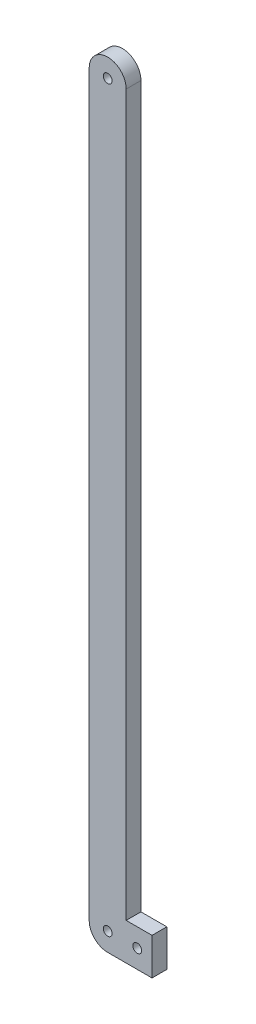
ISO-10303-21;
HEADER;
FILE_DESCRIPTION(('STEP AP214'),'2;1');
FILE_NAME('part.step','',(''),(''),'','','');
FILE_SCHEMA(('AUTOMOTIVE_DESIGN { 1 0 10303 214 1 1 1 1 }'));
ENDSEC;
DATA;
#1=APPLICATION_CONTEXT('core data for automotive mechanical design processes');
#2=APPLICATION_PROTOCOL_DEFINITION('international standard','automotive_design',2000,#1);
#3=PRODUCT_CONTEXT('',#1,'mechanical');
#4=PRODUCT('Part','Part','',(#3));
#5=PRODUCT_RELATED_PRODUCT_CATEGORY('part','',(#4));
#6=PRODUCT_DEFINITION_FORMATION('','',#4);
#7=PRODUCT_DEFINITION_CONTEXT('part definition',#1,'design');
#8=PRODUCT_DEFINITION('design','',#6,#7);
#9=PRODUCT_DEFINITION_SHAPE('','',#8);
#10=(LENGTH_UNIT() NAMED_UNIT(*) SI_UNIT(.MILLI.,.METRE.));
#11=(NAMED_UNIT(*) PLANE_ANGLE_UNIT() SI_UNIT($,.RADIAN.));
#12=(NAMED_UNIT(*) SI_UNIT($,.STERADIAN.) SOLID_ANGLE_UNIT());
#13=UNCERTAINTY_MEASURE_WITH_UNIT(LENGTH_MEASURE(1.E-05),#10,'distance_accuracy_value','');
#14=(GEOMETRIC_REPRESENTATION_CONTEXT(3) GLOBAL_UNCERTAINTY_ASSIGNED_CONTEXT((#13)) GLOBAL_UNIT_ASSIGNED_CONTEXT((#10,
#11,#12)) REPRESENTATION_CONTEXT('',''));
#15=CARTESIAN_POINT('',(0.,0.,0.));
#16=DIRECTION('',(0.,0.,1.));
#17=DIRECTION('',(1.,0.,0.));
#18=AXIS2_PLACEMENT_3D('',#15,#16,#17);
#19=CARTESIAN_POINT('',(0.,0.,10.));
#20=DIRECTION('',(0.,0.,1.));
#21=DIRECTION('',(1.,0.,0.));
#22=AXIS2_PLACEMENT_3D('',#19,#20,#21);
#23=PLANE('',#22);
#24=CARTESIAN_POINT('',(0.,-499.599839871872,10.));
#25=DIRECTION('',(0.,0.,1.));
#26=DIRECTION('',(-1.,0.,0.));
#27=AXIS2_PLACEMENT_3D('',#24,#25,#26);
#28=CIRCLE('',#27,3.);
#29=CARTESIAN_POINT('',(-3.,-499.599839871872,10.));
#30=VERTEX_POINT('',#29);
#31=EDGE_CURVE('E164',#30,#30,#28,.T.);
#32=ORIENTED_EDGE('',*,*,#31,.F.);
#33=EDGE_LOOP('',(#32));
#34=FACE_BOUND('',#33,.T.);
#35=CARTESIAN_POINT('',(0.,0.,10.));
#36=DIRECTION('',(0.,0.,1.));
#37=DIRECTION('',(1.,0.,0.));
#38=AXIS2_PLACEMENT_3D('',#35,#36,#37);
#39=CIRCLE('',#38,12.5);
#40=CARTESIAN_POINT('',(12.5,0.,10.));
#41=VERTEX_POINT('',#40);
#42=CARTESIAN_POINT('',(-12.5,0.,10.));
#43=VERTEX_POINT('',#42);
#44=EDGE_CURVE('E137',#41,#43,#39,.T.);
#45=ORIENTED_EDGE('',*,*,#44,.T.);
#46=DIRECTION('',(0.,-1.,0.));
#47=VECTOR('',#46,1.);
#48=CARTESIAN_POINT('',(-12.5,0.,10.));
#49=LINE('',#48,#47);
#50=CARTESIAN_POINT('',(-12.4999999999999,-499.599839871872,10.));
#51=VERTEX_POINT('',#50);
#52=EDGE_CURVE('E90',#43,#51,#49,.T.);
#53=ORIENTED_EDGE('',*,*,#52,.T.);
#54=CARTESIAN_POINT('',(0.,-499.599839871872,10.));
#55=DIRECTION('',(0.,0.,1.));
#56=DIRECTION('',(-1.,0.,0.));
#57=AXIS2_PLACEMENT_3D('',#54,#55,#56);
#58=CIRCLE('',#57,12.4999999999999);
#59=CARTESIAN_POINT('',(0.,-512.099839871872,10.));
#60=VERTEX_POINT('',#59);
#61=EDGE_CURVE('E149',#51,#60,#58,.T.);
#62=ORIENTED_EDGE('',*,*,#61,.T.);
#63=DIRECTION('',(1.,0.,0.));
#64=VECTOR('',#63,1.);
#65=CARTESIAN_POINT('',(0.,-512.099839871872,10.));
#66=LINE('',#65,#64);
#67=CARTESIAN_POINT('',(30.,-512.099839871872,10.));
#68=VERTEX_POINT('',#67);
#69=EDGE_CURVE('E106',#60,#68,#66,.T.);
#70=ORIENTED_EDGE('',*,*,#69,.T.);
#71=DIRECTION('',(0.,1.,0.));
#72=VECTOR('',#71,1.);
#73=CARTESIAN_POINT('',(30.,-512.099839871872,10.));
#74=LINE('',#73,#72);
#75=CARTESIAN_POINT('',(30.,-487.099839871872,10.));
#76=VERTEX_POINT('',#75);
#77=EDGE_CURVE('E100',#68,#76,#74,.T.);
#78=ORIENTED_EDGE('',*,*,#77,.T.);
#79=DIRECTION('',(-1.,0.,0.));
#80=VECTOR('',#79,1.);
#81=CARTESIAN_POINT('',(30.,-487.099839871872,10.));
#82=LINE('',#81,#80);
#83=CARTESIAN_POINT('',(12.5000000000001,-487.099839871872,10.));
#84=VERTEX_POINT('',#83);
#85=EDGE_CURVE('E104',#76,#84,#82,.T.);
#86=ORIENTED_EDGE('',*,*,#85,.T.);
#87=DIRECTION('',(0.,1.,0.));
#88=VECTOR('',#87,1.);
#89=CARTESIAN_POINT('',(12.5,0.,10.));
#90=LINE('',#89,#88);
#91=EDGE_CURVE('E50',#84,#41,#90,.T.);
#92=ORIENTED_EDGE('',*,*,#91,.T.);
#93=EDGE_LOOP('',(#45,#53,#62,#70,#78,#86,#92));
#94=FACE_BOUND('',#93,.T.);
#95=CARTESIAN_POINT('',(0.,0.,10.));
#96=DIRECTION('',(0.,0.,1.));
#97=DIRECTION('',(1.,0.,0.));
#98=AXIS2_PLACEMENT_3D('',#95,#96,#97);
#99=CIRCLE('',#98,3.);
#100=CARTESIAN_POINT('',(3.,0.,10.));
#101=VERTEX_POINT('',#100);
#102=EDGE_CURVE('E128',#101,#101,#99,.T.);
#103=ORIENTED_EDGE('',*,*,#102,.F.);
#104=EDGE_LOOP('',(#103));
#105=FACE_BOUND('',#104,.T.);
#106=CARTESIAN_POINT('',(20.,-499.599839871872,10.));
#107=DIRECTION('',(0.,0.,1.));
#108=DIRECTION('',(1.,0.,0.));
#109=AXIS2_PLACEMENT_3D('',#106,#107,#108);
#110=CIRCLE('',#109,3.);
#111=CARTESIAN_POINT('',(23.,-499.599839871872,10.));
#112=VERTEX_POINT('',#111);
#113=EDGE_CURVE('E170',#112,#112,#110,.T.);
#114=ORIENTED_EDGE('',*,*,#113,.F.);
#115=EDGE_LOOP('',(#114));
#116=FACE_BOUND('',#115,.T.);
#117=ADVANCED_FACE('F33',(#34,#94,#105,#116),#23,.T.);
#118=CARTESIAN_POINT('',(0.,0.,0.));
#119=DIRECTION('',(0.,0.,1.));
#120=DIRECTION('',(1.,0.,0.));
#121=AXIS2_PLACEMENT_3D('',#118,#119,#120);
#122=PLANE('',#121);
#123=CARTESIAN_POINT('',(0.,0.,0.));
#124=DIRECTION('',(0.,0.,1.));
#125=DIRECTION('',(1.,0.,0.));
#126=AXIS2_PLACEMENT_3D('',#123,#124,#125);
#127=CIRCLE('',#126,12.5);
#128=CARTESIAN_POINT('',(12.5,0.,0.));
#129=VERTEX_POINT('',#128);
#130=CARTESIAN_POINT('',(-12.5,0.,0.));
#131=VERTEX_POINT('',#130);
#132=EDGE_CURVE('E124',#129,#131,#127,.T.);
#133=ORIENTED_EDGE('',*,*,#132,.F.);
#134=DIRECTION('',(0.,1.,0.));
#135=VECTOR('',#134,1.);
#136=CARTESIAN_POINT('',(12.5,0.,0.));
#137=LINE('',#136,#135);
#138=CARTESIAN_POINT('',(12.5000000000001,-487.099839871872,0.));
#139=VERTEX_POINT('',#138);
#140=EDGE_CURVE('E82',#139,#129,#137,.T.);
#141=ORIENTED_EDGE('',*,*,#140,.F.);
#142=DIRECTION('',(-1.,0.,0.));
#143=VECTOR('',#142,1.);
#144=CARTESIAN_POINT('',(30.,-487.099839871872,0.));
#145=LINE('',#144,#143);
#146=CARTESIAN_POINT('',(30.,-487.099839871872,0.));
#147=VERTEX_POINT('',#146);
#148=EDGE_CURVE('E76',#147,#139,#145,.T.);
#149=ORIENTED_EDGE('',*,*,#148,.F.);
#150=DIRECTION('',(0.,1.,0.));
#151=VECTOR('',#150,1.);
#152=CARTESIAN_POINT('',(30.,-512.099839871872,0.));
#153=LINE('',#152,#151);
#154=CARTESIAN_POINT('',(30.,-512.099839871872,0.));
#155=VERTEX_POINT('',#154);
#156=EDGE_CURVE('E114',#155,#147,#153,.T.);
#157=ORIENTED_EDGE('',*,*,#156,.F.);
#158=DIRECTION('',(1.,0.,0.));
#159=VECTOR('',#158,1.);
#160=CARTESIAN_POINT('',(0.,-512.099839871872,0.));
#161=LINE('',#160,#159);
#162=CARTESIAN_POINT('',(0.,-512.099839871872,0.));
#163=VERTEX_POINT('',#162);
#164=EDGE_CURVE('E132',#163,#155,#161,.T.);
#165=ORIENTED_EDGE('',*,*,#164,.F.);
#166=CARTESIAN_POINT('',(0.,-499.599839871872,0.));
#167=DIRECTION('',(0.,0.,1.));
#168=DIRECTION('',(-1.,0.,0.));
#169=AXIS2_PLACEMENT_3D('',#166,#167,#168);
#170=CIRCLE('',#169,12.4999999999999);
#171=CARTESIAN_POINT('',(-12.4999999999999,-499.599839871872,0.));
#172=VERTEX_POINT('',#171);
#173=EDGE_CURVE('E130',#172,#163,#170,.T.);
#174=ORIENTED_EDGE('',*,*,#173,.F.);
#175=DIRECTION('',(0.,-1.,0.));
#176=VECTOR('',#175,1.);
#177=CARTESIAN_POINT('',(-12.5,0.,0.));
#178=LINE('',#177,#176);
#179=EDGE_CURVE('E127',#131,#172,#178,.T.);
#180=ORIENTED_EDGE('',*,*,#179,.F.);
#181=EDGE_LOOP('',(#133,#141,#149,#157,#165,#174,#180));
#182=FACE_BOUND('',#181,.T.);
#183=CARTESIAN_POINT('',(0.,0.,0.));
#184=DIRECTION('',(0.,0.,1.));
#185=DIRECTION('',(1.,0.,0.));
#186=AXIS2_PLACEMENT_3D('',#183,#184,#185);
#187=CIRCLE('',#186,3.);
#188=CARTESIAN_POINT('',(3.,0.,0.));
#189=VERTEX_POINT('',#188);
#190=EDGE_CURVE('E161',#189,#189,#187,.T.);
#191=ORIENTED_EDGE('',*,*,#190,.T.);
#192=EDGE_LOOP('',(#191));
#193=FACE_BOUND('',#192,.T.);
#194=CARTESIAN_POINT('',(0.,-499.599839871872,0.));
#195=DIRECTION('',(0.,0.,1.));
#196=DIRECTION('',(-1.,0.,0.));
#197=AXIS2_PLACEMENT_3D('',#194,#195,#196);
#198=CIRCLE('',#197,3.);
#199=CARTESIAN_POINT('',(-3.,-499.599839871872,0.));
#200=VERTEX_POINT('',#199);
#201=EDGE_CURVE('E167',#200,#200,#198,.T.);
#202=ORIENTED_EDGE('',*,*,#201,.T.);
#203=EDGE_LOOP('',(#202));
#204=FACE_BOUND('',#203,.T.);
#205=CARTESIAN_POINT('',(20.,-499.599839871872,0.));
#206=DIRECTION('',(0.,0.,1.));
#207=DIRECTION('',(1.,0.,0.));
#208=AXIS2_PLACEMENT_3D('',#205,#206,#207);
#209=CIRCLE('',#208,3.);
#210=CARTESIAN_POINT('',(23.,-499.599839871872,0.));
#211=VERTEX_POINT('',#210);
#212=EDGE_CURVE('E173',#211,#211,#209,.T.);
#213=ORIENTED_EDGE('',*,*,#212,.T.);
#214=EDGE_LOOP('',(#213));
#215=FACE_BOUND('',#214,.T.);
#216=ADVANCED_FACE('F153',(#182,#193,#204,#215),#122,.F.);
#217=CARTESIAN_POINT('',(0.,0.,10.));
#218=DIRECTION('',(0.,0.,-1.));
#219=DIRECTION('',(-1.,0.,0.));
#220=AXIS2_PLACEMENT_3D('',#217,#218,#219);
#221=CYLINDRICAL_SURFACE('',#220,12.5);
#222=ORIENTED_EDGE('',*,*,#132,.T.);
#223=DIRECTION('',(0.,0.,-1.));
#224=VECTOR('',#223,1.);
#225=CARTESIAN_POINT('',(-12.5,0.,10.));
#226=LINE('',#225,#224);
#227=EDGE_CURVE('E11',#43,#131,#226,.T.);
#228=ORIENTED_EDGE('',*,*,#227,.F.);
#229=ORIENTED_EDGE('',*,*,#44,.F.);
#230=DIRECTION('',(0.,0.,-1.));
#231=VECTOR('',#230,1.);
#232=CARTESIAN_POINT('',(12.5,0.,10.));
#233=LINE('',#232,#231);
#234=EDGE_CURVE('E120',#41,#129,#233,.T.);
#235=ORIENTED_EDGE('',*,*,#234,.T.);
#236=EDGE_LOOP('',(#222,#228,#229,#235));
#237=FACE_BOUND('',#236,.T.);
#238=ADVANCED_FACE('F35',(#237),#221,.T.);
#239=CARTESIAN_POINT('',(-12.5,0.,10.));
#240=DIRECTION('',(1.,0.,0.));
#241=DIRECTION('',(0.,1.,0.));
#242=AXIS2_PLACEMENT_3D('',#239,#240,#241);
#243=PLANE('',#242);
#244=ORIENTED_EDGE('',*,*,#179,.T.);
#245=DIRECTION('',(0.,0.,-1.));
#246=VECTOR('',#245,1.);
#247=CARTESIAN_POINT('',(-12.4999999999999,-499.599839871872,10.));
#248=LINE('',#247,#246);
#249=EDGE_CURVE('E42',#51,#172,#248,.T.);
#250=ORIENTED_EDGE('',*,*,#249,.F.);
#251=ORIENTED_EDGE('',*,*,#52,.F.);
#252=ORIENTED_EDGE('',*,*,#227,.T.);
#253=EDGE_LOOP('',(#244,#250,#251,#252));
#254=FACE_BOUND('',#253,.T.);
#255=ADVANCED_FACE('F204',(#254),#243,.F.);
#256=CARTESIAN_POINT('',(0.,-499.599839871872,10.));
#257=DIRECTION('',(0.,0.,-1.));
#258=DIRECTION('',(-1.,0.,0.));
#259=AXIS2_PLACEMENT_3D('',#256,#257,#258);
#260=CYLINDRICAL_SURFACE('',#259,12.4999999999999);
#261=ORIENTED_EDGE('',*,*,#173,.T.);
#262=DIRECTION('',(0.,0.,-1.));
#263=VECTOR('',#262,1.);
#264=CARTESIAN_POINT('',(0.,-512.099839871872,10.));
#265=LINE('',#264,#263);
#266=EDGE_CURVE('E141',#60,#163,#265,.T.);
#267=ORIENTED_EDGE('',*,*,#266,.F.);
#268=ORIENTED_EDGE('',*,*,#61,.F.);
#269=ORIENTED_EDGE('',*,*,#249,.T.);
#270=EDGE_LOOP('',(#261,#267,#268,#269));
#271=FACE_BOUND('',#270,.T.);
#272=ADVANCED_FACE('F147',(#271),#260,.T.);
#273=CARTESIAN_POINT('',(0.,-512.099839871872,10.));
#274=DIRECTION('',(0.,1.,0.));
#275=DIRECTION('',(0.,0.,1.));
#276=AXIS2_PLACEMENT_3D('',#273,#274,#275);
#277=PLANE('',#276);
#278=ORIENTED_EDGE('',*,*,#164,.T.);
#279=DIRECTION('',(0.,0.,-1.));
#280=VECTOR('',#279,1.);
#281=CARTESIAN_POINT('',(30.,-512.099839871872,10.));
#282=LINE('',#281,#280);
#283=EDGE_CURVE('E115',#68,#155,#282,.T.);
#284=ORIENTED_EDGE('',*,*,#283,.F.);
#285=ORIENTED_EDGE('',*,*,#69,.F.);
#286=ORIENTED_EDGE('',*,*,#266,.T.);
#287=EDGE_LOOP('',(#278,#284,#285,#286));
#288=FACE_BOUND('',#287,.T.);
#289=ADVANCED_FACE('F156',(#288),#277,.F.);
#290=CARTESIAN_POINT('',(30.,-512.099839871872,10.));
#291=DIRECTION('',(-1.,0.,0.));
#292=DIRECTION('',(0.,0.,1.));
#293=AXIS2_PLACEMENT_3D('',#290,#291,#292);
#294=PLANE('',#293);
#295=ORIENTED_EDGE('',*,*,#156,.T.);
#296=DIRECTION('',(0.,0.,-1.));
#297=VECTOR('',#296,1.);
#298=CARTESIAN_POINT('',(30.,-487.099839871872,10.));
#299=LINE('',#298,#297);
#300=EDGE_CURVE('E111',#76,#147,#299,.T.);
#301=ORIENTED_EDGE('',*,*,#300,.F.);
#302=ORIENTED_EDGE('',*,*,#77,.F.);
#303=ORIENTED_EDGE('',*,*,#283,.T.);
#304=EDGE_LOOP('',(#295,#301,#302,#303));
#305=FACE_BOUND('',#304,.T.);
#306=ADVANCED_FACE('F112',(#305),#294,.F.);
#307=CARTESIAN_POINT('',(30.,-487.099839871872,10.));
#308=DIRECTION('',(0.,-1.,0.));
#309=DIRECTION('',(0.,0.,-1.));
#310=AXIS2_PLACEMENT_3D('',#307,#308,#309);
#311=PLANE('',#310);
#312=ORIENTED_EDGE('',*,*,#148,.T.);
#313=DIRECTION('',(0.,0.,-1.));
#314=VECTOR('',#313,1.);
#315=CARTESIAN_POINT('',(12.5000000000001,-487.099839871872,10.));
#316=LINE('',#315,#314);
#317=EDGE_CURVE('E116',#84,#139,#316,.T.);
#318=ORIENTED_EDGE('',*,*,#317,.F.);
#319=ORIENTED_EDGE('',*,*,#85,.F.);
#320=ORIENTED_EDGE('',*,*,#300,.T.);
#321=EDGE_LOOP('',(#312,#318,#319,#320));
#322=FACE_BOUND('',#321,.T.);
#323=ADVANCED_FACE('F118',(#322),#311,.F.);
#324=CARTESIAN_POINT('',(12.5,0.,10.));
#325=DIRECTION('',(-1.,0.,0.));
#326=DIRECTION('',(0.,-1.,0.));
#327=AXIS2_PLACEMENT_3D('',#324,#325,#326);
#328=PLANE('',#327);
#329=ORIENTED_EDGE('',*,*,#140,.T.);
#330=ORIENTED_EDGE('',*,*,#234,.F.);
#331=ORIENTED_EDGE('',*,*,#91,.F.);
#332=ORIENTED_EDGE('',*,*,#317,.T.);
#333=EDGE_LOOP('',(#329,#330,#331,#332));
#334=FACE_BOUND('',#333,.T.);
#335=ADVANCED_FACE('F194',(#334),#328,.F.);
#336=CARTESIAN_POINT('',(0.,0.,10.));
#337=DIRECTION('',(0.,0.,-1.));
#338=DIRECTION('',(-1.,0.,0.));
#339=AXIS2_PLACEMENT_3D('',#336,#337,#338);
#340=CYLINDRICAL_SURFACE('',#339,3.);
#341=ORIENTED_EDGE('',*,*,#102,.T.);
#342=EDGE_LOOP('',(#341));
#343=FACE_BOUND('',#342,.T.);
#344=ORIENTED_EDGE('',*,*,#190,.F.);
#345=EDGE_LOOP('',(#344));
#346=FACE_BOUND('',#345,.T.);
#347=ADVANCED_FACE('F191',(#343,#346),#340,.F.);
#348=CARTESIAN_POINT('',(0.,-499.599839871872,10.));
#349=DIRECTION('',(0.,0.,-1.));
#350=DIRECTION('',(-1.,0.,0.));
#351=AXIS2_PLACEMENT_3D('',#348,#349,#350);
#352=CYLINDRICAL_SURFACE('',#351,3.);
#353=ORIENTED_EDGE('',*,*,#31,.T.);
#354=EDGE_LOOP('',(#353));
#355=FACE_BOUND('',#354,.T.);
#356=ORIENTED_EDGE('',*,*,#201,.F.);
#357=EDGE_LOOP('',(#356));
#358=FACE_BOUND('',#357,.T.);
#359=ADVANCED_FACE('F263',(#355,#358),#352,.F.);
#360=CARTESIAN_POINT('',(20.,-499.599839871872,10.));
#361=DIRECTION('',(0.,0.,-1.));
#362=DIRECTION('',(-1.,0.,0.));
#363=AXIS2_PLACEMENT_3D('',#360,#361,#362);
#364=CYLINDRICAL_SURFACE('',#363,3.);
#365=ORIENTED_EDGE('',*,*,#113,.T.);
#366=EDGE_LOOP('',(#365));
#367=FACE_BOUND('',#366,.T.);
#368=ORIENTED_EDGE('',*,*,#212,.F.);
#369=EDGE_LOOP('',(#368));
#370=FACE_BOUND('',#369,.T.);
#371=ADVANCED_FACE('F179',(#367,#370),#364,.F.);
#372=CLOSED_SHELL('',(#117,#216,#238,#255,#272,#289,#306,#323,#335,#347,#359,#371));
#373=MANIFOLD_SOLID_BREP('B2',#372);
#374=ADVANCED_BREP_SHAPE_REPRESENTATION('',(#18,#373),#14);
#375=SHAPE_DEFINITION_REPRESENTATION(#9,#374);
ENDSEC;
END-ISO-10303-21;
